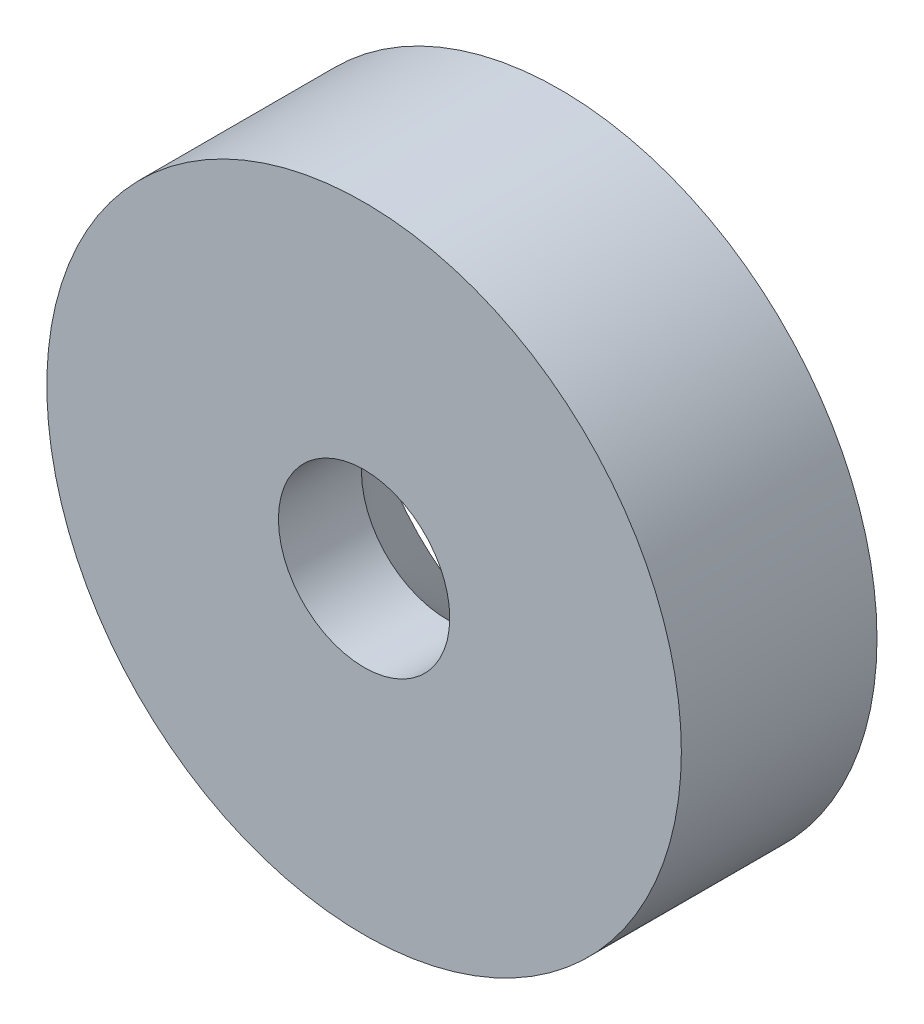
ISO-10303-21;
HEADER;
FILE_DESCRIPTION(('STEP AP214'),'2;1');
FILE_NAME('part.step','',(''),(''),'','','');
FILE_SCHEMA(('AUTOMOTIVE_DESIGN { 1 0 10303 214 1 1 1 1 }'));
ENDSEC;
DATA;
#1=APPLICATION_CONTEXT('core data for automotive mechanical design processes');
#2=APPLICATION_PROTOCOL_DEFINITION('international standard','automotive_design',2000,#1);
#3=PRODUCT_CONTEXT('',#1,'mechanical');
#4=PRODUCT('Part','Part','',(#3));
#5=PRODUCT_RELATED_PRODUCT_CATEGORY('part','',(#4));
#6=PRODUCT_DEFINITION_FORMATION('','',#4);
#7=PRODUCT_DEFINITION_CONTEXT('part definition',#1,'design');
#8=PRODUCT_DEFINITION('design','',#6,#7);
#9=PRODUCT_DEFINITION_SHAPE('','',#8);
#10=(LENGTH_UNIT() NAMED_UNIT(*) SI_UNIT(.MILLI.,.METRE.));
#11=(NAMED_UNIT(*) PLANE_ANGLE_UNIT() SI_UNIT($,.RADIAN.));
#12=(NAMED_UNIT(*) SI_UNIT($,.STERADIAN.) SOLID_ANGLE_UNIT());
#13=UNCERTAINTY_MEASURE_WITH_UNIT(LENGTH_MEASURE(1.E-05),#10,'distance_accuracy_value','');
#14=(GEOMETRIC_REPRESENTATION_CONTEXT(3) GLOBAL_UNCERTAINTY_ASSIGNED_CONTEXT((#13)) GLOBAL_UNIT_ASSIGNED_CONTEXT((#10,
#11,#12)) REPRESENTATION_CONTEXT('',''));
#15=CARTESIAN_POINT('',(0.,0.,0.));
#16=DIRECTION('',(0.,0.,1.));
#17=DIRECTION('',(1.,0.,0.));
#18=AXIS2_PLACEMENT_3D('',#15,#16,#17);
#19=CARTESIAN_POINT('',(5.05628521189009,23.0789914296533,3.7));
#20=DIRECTION('',(0.,0.,1.));
#21=DIRECTION('',(1.,0.,0.));
#22=AXIS2_PLACEMENT_3D('',#19,#20,#21);
#23=PLANE('',#22);
#24=CARTESIAN_POINT('',(5.05628521189009,23.0789914296533,3.7));
#25=DIRECTION('',(0.,0.,1.));
#26=DIRECTION('',(1.,0.,0.));
#27=AXIS2_PLACEMENT_3D('',#24,#25,#26);
#28=CIRCLE('',#27,6.);
#29=CARTESIAN_POINT('',(11.0562852118901,23.0789914296533,3.7));
#30=VERTEX_POINT('',#29);
#31=EDGE_CURVE('E10',#30,#30,#28,.T.);
#32=ORIENTED_EDGE('',*,*,#31,.T.);
#33=EDGE_LOOP('',(#32));
#34=FACE_BOUND('',#33,.T.);
#35=CARTESIAN_POINT('',(5.05628521189009,23.0789914296533,3.7));
#36=DIRECTION('',(0.,0.,1.));
#37=DIRECTION('',(1.,0.,0.));
#38=AXIS2_PLACEMENT_3D('',#35,#36,#37);
#39=CIRCLE('',#38,1.62);
#40=CARTESIAN_POINT('',(6.67628521189009,23.0789914296533,3.7));
#41=VERTEX_POINT('',#40);
#42=EDGE_CURVE('E43',#41,#41,#39,.T.);
#43=ORIENTED_EDGE('',*,*,#42,.F.);
#44=EDGE_LOOP('',(#43));
#45=FACE_BOUND('',#44,.T.);
#46=ADVANCED_FACE('F30',(#34,#45),#23,.T.);
#47=CARTESIAN_POINT('',(5.05628521189009,23.0789914296533,0.));
#48=DIRECTION('',(0.,0.,1.));
#49=DIRECTION('',(1.,0.,0.));
#50=AXIS2_PLACEMENT_3D('',#47,#48,#49);
#51=PLANE('',#50);
#52=CARTESIAN_POINT('',(5.05628521189009,23.0789914296533,0.));
#53=DIRECTION('',(0.,0.,-1.));
#54=DIRECTION('',(-1.,0.,0.));
#55=AXIS2_PLACEMENT_3D('',#52,#53,#54);
#56=CIRCLE('',#55,3.75);
#57=CARTESIAN_POINT('',(1.30628521189009,23.0789914296533,0.));
#58=VERTEX_POINT('',#57);
#59=EDGE_CURVE('E47',#58,#58,#56,.T.);
#60=ORIENTED_EDGE('',*,*,#59,.F.);
#61=EDGE_LOOP('',(#60));
#62=FACE_BOUND('',#61,.T.);
#63=CARTESIAN_POINT('',(5.05628521189009,23.0789914296533,0.));
#64=DIRECTION('',(0.,0.,1.));
#65=DIRECTION('',(1.,0.,0.));
#66=AXIS2_PLACEMENT_3D('',#63,#64,#65);
#67=CIRCLE('',#66,6.);
#68=CARTESIAN_POINT('',(11.0562852118901,23.0789914296533,0.));
#69=VERTEX_POINT('',#68);
#70=EDGE_CURVE('E38',#69,#69,#67,.T.);
#71=ORIENTED_EDGE('',*,*,#70,.F.);
#72=EDGE_LOOP('',(#71));
#73=FACE_BOUND('',#72,.T.);
#74=ADVANCED_FACE('F63',(#62,#73),#51,.F.);
#75=CARTESIAN_POINT('',(5.05628521189009,23.0789914296533,3.7));
#76=DIRECTION('',(0.,0.,-1.));
#77=DIRECTION('',(-1.,0.,0.));
#78=AXIS2_PLACEMENT_3D('',#75,#76,#77);
#79=CYLINDRICAL_SURFACE('',#78,6.);
#80=ORIENTED_EDGE('',*,*,#31,.F.);
#81=EDGE_LOOP('',(#80));
#82=FACE_BOUND('',#81,.T.);
#83=ORIENTED_EDGE('',*,*,#70,.T.);
#84=EDGE_LOOP('',(#83));
#85=FACE_BOUND('',#84,.T.);
#86=ADVANCED_FACE('F32',(#82,#85),#79,.T.);
#87=CARTESIAN_POINT('',(5.05628521189009,23.0789914296533,3.7));
#88=DIRECTION('',(0.,0.,-1.));
#89=DIRECTION('',(-1.,0.,0.));
#90=AXIS2_PLACEMENT_3D('',#87,#88,#89);
#91=CYLINDRICAL_SURFACE('',#90,1.62);
#92=CARTESIAN_POINT('',(5.05628521189009,23.0789914296533,2.12999999999999));
#93=DIRECTION('',(0.,0.,-1.));
#94=DIRECTION('',(-1.,0.,0.));
#95=AXIS2_PLACEMENT_3D('',#92,#93,#94);
#96=CIRCLE('',#95,1.62);
#97=CARTESIAN_POINT('',(3.43628521189009,23.0789914296533,2.12999999999999));
#98=VERTEX_POINT('',#97);
#99=EDGE_CURVE('E34',#98,#98,#96,.F.);
#100=ORIENTED_EDGE('',*,*,#99,.F.);
#101=EDGE_LOOP('',(#100));
#102=FACE_BOUND('',#101,.T.);
#103=ORIENTED_EDGE('',*,*,#42,.T.);
#104=EDGE_LOOP('',(#103));
#105=FACE_BOUND('',#104,.T.);
#106=ADVANCED_FACE('F56',(#102,#105),#91,.F.);
#107=CARTESIAN_POINT('',(5.05628521189009,23.0789914296533,0.));
#108=DIRECTION('',(0.,0.,-1.));
#109=DIRECTION('',(-1.,0.,0.));
#110=AXIS2_PLACEMENT_3D('',#107,#108,#109);
#111=CONICAL_SURFACE('',#110,3.75,0.78539816339745);
#112=ORIENTED_EDGE('',*,*,#99,.T.);
#113=EDGE_LOOP('',(#112));
#114=FACE_BOUND('',#113,.T.);
#115=ORIENTED_EDGE('',*,*,#59,.T.);
#116=EDGE_LOOP('',(#115));
#117=FACE_BOUND('',#116,.T.);
#118=ADVANCED_FACE('F54',(#114,#117),#111,.F.);
#119=CLOSED_SHELL('',(#46,#74,#86,#106,#118));
#120=MANIFOLD_SOLID_BREP('B2',#119);
#121=ADVANCED_BREP_SHAPE_REPRESENTATION('',(#18,#120),#14);
#122=SHAPE_DEFINITION_REPRESENTATION(#9,#121);
ENDSEC;
END-ISO-10303-21;
